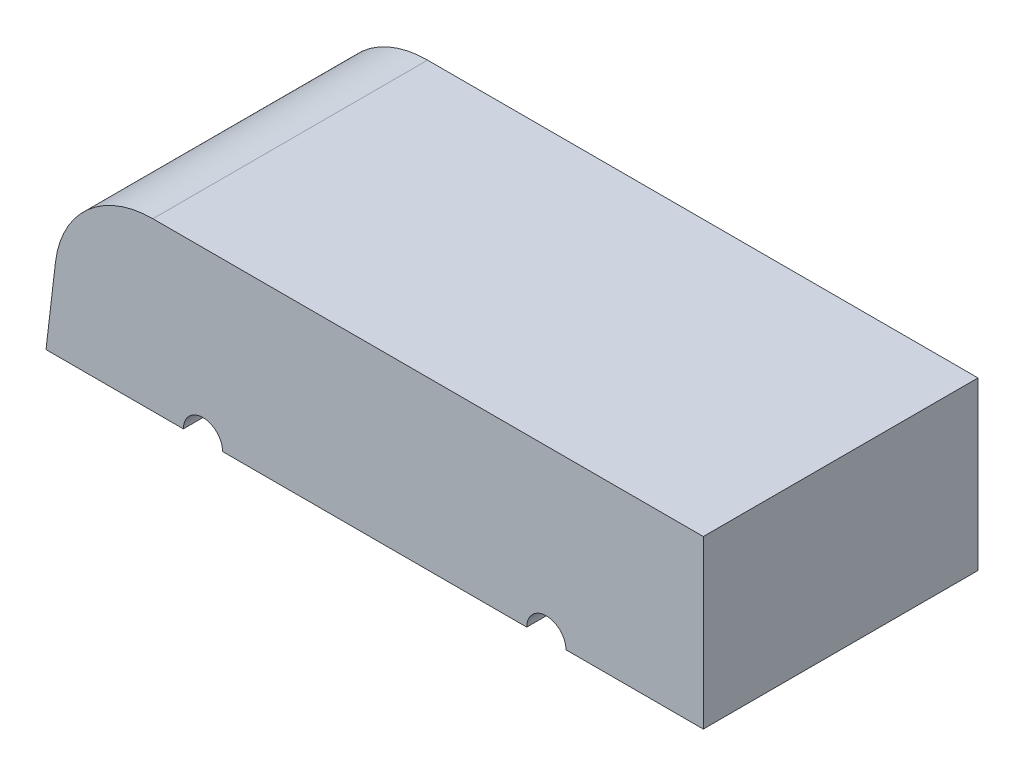
ISO-10303-21;
HEADER;
FILE_DESCRIPTION(('STEP AP214'),'2;1');
FILE_NAME('part.step','',(''),(''),'','','');
FILE_SCHEMA(('AUTOMOTIVE_DESIGN { 1 0 10303 214 1 1 1 1 }'));
ENDSEC;
DATA;
#1=APPLICATION_CONTEXT('core data for automotive mechanical design processes');
#2=APPLICATION_PROTOCOL_DEFINITION('international standard','automotive_design',2000,#1);
#3=PRODUCT_CONTEXT('',#1,'mechanical');
#4=PRODUCT('Part','Part','',(#3));
#5=PRODUCT_RELATED_PRODUCT_CATEGORY('part','',(#4));
#6=PRODUCT_DEFINITION_FORMATION('','',#4);
#7=PRODUCT_DEFINITION_CONTEXT('part definition',#1,'design');
#8=PRODUCT_DEFINITION('design','',#6,#7);
#9=PRODUCT_DEFINITION_SHAPE('','',#8);
#10=(LENGTH_UNIT() NAMED_UNIT(*) SI_UNIT(.MILLI.,.METRE.));
#11=(NAMED_UNIT(*) PLANE_ANGLE_UNIT() SI_UNIT($,.RADIAN.));
#12=(NAMED_UNIT(*) SI_UNIT($,.STERADIAN.) SOLID_ANGLE_UNIT());
#13=UNCERTAINTY_MEASURE_WITH_UNIT(LENGTH_MEASURE(1.E-05),#10,'distance_accuracy_value','');
#14=(GEOMETRIC_REPRESENTATION_CONTEXT(3) GLOBAL_UNCERTAINTY_ASSIGNED_CONTEXT((#13)) GLOBAL_UNIT_ASSIGNED_CONTEXT((#10,
#11,#12)) REPRESENTATION_CONTEXT('',''));
#15=CARTESIAN_POINT('',(0.,0.,0.));
#16=DIRECTION('',(0.,0.,1.));
#17=DIRECTION('',(1.,0.,0.));
#18=AXIS2_PLACEMENT_3D('',#15,#16,#17);
#19=CARTESIAN_POINT('',(0.,0.,35.56));
#20=DIRECTION('',(0.,1.,0.));
#21=DIRECTION('',(0.,0.,1.));
#22=AXIS2_PLACEMENT_3D('',#19,#20,#21);
#23=PLANE('',#22);
#24=DIRECTION('',(1.,0.,0.));
#25=VECTOR('',#24,1.);
#26=CARTESIAN_POINT('',(0.,0.,0.));
#27=LINE('',#26,#25);
#28=CARTESIAN_POINT('',(0.,0.,0.));
#29=VERTEX_POINT('',#28);
#30=CARTESIAN_POINT('',(17.78,0.,0.));
#31=VERTEX_POINT('',#30);
#32=EDGE_CURVE('E129',#29,#31,#27,.T.);
#33=ORIENTED_EDGE('',*,*,#32,.T.);
#34=DIRECTION('',(0.,0.,-1.));
#35=VECTOR('',#34,1.);
#36=CARTESIAN_POINT('',(17.78,0.,35.56));
#37=LINE('',#36,#35);
#38=CARTESIAN_POINT('',(17.78,0.,35.56));
#39=VERTEX_POINT('',#38);
#40=EDGE_CURVE('E110',#39,#31,#37,.T.);
#41=ORIENTED_EDGE('',*,*,#40,.F.);
#42=DIRECTION('',(1.,0.,0.));
#43=VECTOR('',#42,1.);
#44=CARTESIAN_POINT('',(0.,0.,35.56));
#45=LINE('',#44,#43);
#46=CARTESIAN_POINT('',(0.,0.,35.56));
#47=VERTEX_POINT('',#46);
#48=EDGE_CURVE('E117',#47,#39,#45,.T.);
#49=ORIENTED_EDGE('',*,*,#48,.F.);
#50=DIRECTION('',(0.,0.,-1.));
#51=VECTOR('',#50,1.);
#52=CARTESIAN_POINT('',(0.,0.,35.56));
#53=LINE('',#52,#51);
#54=EDGE_CURVE('E149',#47,#29,#53,.T.);
#55=ORIENTED_EDGE('',*,*,#54,.T.);
#56=EDGE_LOOP('',(#33,#41,#49,#55));
#57=FACE_BOUND('',#56,.T.);
#58=ADVANCED_FACE('F35',(#57),#23,.F.);
#59=CARTESIAN_POINT('',(20.32,0.,35.56));
#60=DIRECTION('',(0.,0.,-1.));
#61=DIRECTION('',(-1.,0.,0.));
#62=AXIS2_PLACEMENT_3D('',#59,#60,#61);
#63=CYLINDRICAL_SURFACE('',#62,2.54);
#64=CARTESIAN_POINT('',(20.32,0.,0.));
#65=DIRECTION('',(0.,0.,-1.));
#66=DIRECTION('',(-1.,0.,0.));
#67=AXIS2_PLACEMENT_3D('',#64,#65,#66);
#68=CIRCLE('',#67,2.54);
#69=CARTESIAN_POINT('',(22.86,0.,0.));
#70=VERTEX_POINT('',#69);
#71=EDGE_CURVE('E162',#31,#70,#68,.T.);
#72=ORIENTED_EDGE('',*,*,#71,.T.);
#73=DIRECTION('',(0.,0.,-1.));
#74=VECTOR('',#73,1.);
#75=CARTESIAN_POINT('',(22.86,0.,35.56));
#76=LINE('',#75,#74);
#77=CARTESIAN_POINT('',(22.86,0.,35.56));
#78=VERTEX_POINT('',#77);
#79=EDGE_CURVE('E113',#78,#70,#76,.T.);
#80=ORIENTED_EDGE('',*,*,#79,.F.);
#81=CARTESIAN_POINT('',(20.32,0.,35.56));
#82=DIRECTION('',(0.,0.,-1.));
#83=DIRECTION('',(-1.,0.,0.));
#84=AXIS2_PLACEMENT_3D('',#81,#82,#83);
#85=CIRCLE('',#84,2.54);
#86=EDGE_CURVE('E106',#39,#78,#85,.T.);
#87=ORIENTED_EDGE('',*,*,#86,.F.);
#88=ORIENTED_EDGE('',*,*,#40,.T.);
#89=EDGE_LOOP('',(#72,#80,#87,#88));
#90=FACE_BOUND('',#89,.T.);
#91=ADVANCED_FACE('F108',(#90),#63,.F.);
#92=CARTESIAN_POINT('',(22.86,0.,35.56));
#93=DIRECTION('',(0.,1.,0.));
#94=DIRECTION('',(0.,0.,1.));
#95=AXIS2_PLACEMENT_3D('',#92,#93,#94);
#96=PLANE('',#95);
#97=DIRECTION('',(1.,0.,0.));
#98=VECTOR('',#97,1.);
#99=CARTESIAN_POINT('',(22.86,0.,0.));
#100=LINE('',#99,#98);
#101=CARTESIAN_POINT('',(62.23,0.,0.));
#102=VERTEX_POINT('',#101);
#103=EDGE_CURVE('E160',#70,#102,#100,.T.);
#104=ORIENTED_EDGE('',*,*,#103,.T.);
#105=DIRECTION('',(0.,0.,-1.));
#106=VECTOR('',#105,1.);
#107=CARTESIAN_POINT('',(62.23,0.,35.56));
#108=LINE('',#107,#106);
#109=CARTESIAN_POINT('',(62.23,0.,35.56));
#110=VERTEX_POINT('',#109);
#111=EDGE_CURVE('E134',#110,#102,#108,.T.);
#112=ORIENTED_EDGE('',*,*,#111,.F.);
#113=DIRECTION('',(1.,0.,0.));
#114=VECTOR('',#113,1.);
#115=CARTESIAN_POINT('',(22.86,0.,35.56));
#116=LINE('',#115,#114);
#117=EDGE_CURVE('E116',#78,#110,#116,.T.);
#118=ORIENTED_EDGE('',*,*,#117,.F.);
#119=ORIENTED_EDGE('',*,*,#79,.T.);
#120=EDGE_LOOP('',(#104,#112,#118,#119));
#121=FACE_BOUND('',#120,.T.);
#122=ADVANCED_FACE('F178',(#121),#96,.F.);
#123=CARTESIAN_POINT('',(64.77,0.,35.56));
#124=DIRECTION('',(0.,0.,-1.));
#125=DIRECTION('',(-1.,0.,0.));
#126=AXIS2_PLACEMENT_3D('',#123,#124,#125);
#127=CYLINDRICAL_SURFACE('',#126,2.54);
#128=CARTESIAN_POINT('',(64.77,0.,0.));
#129=DIRECTION('',(0.,0.,-1.));
#130=DIRECTION('',(-1.,0.,0.));
#131=AXIS2_PLACEMENT_3D('',#128,#129,#130);
#132=CIRCLE('',#131,2.54);
#133=CARTESIAN_POINT('',(67.31,0.,0.));
#134=VERTEX_POINT('',#133);
#135=EDGE_CURVE('E158',#102,#134,#132,.T.);
#136=ORIENTED_EDGE('',*,*,#135,.T.);
#137=DIRECTION('',(0.,0.,-1.));
#138=VECTOR('',#137,1.);
#139=CARTESIAN_POINT('',(67.31,0.,35.56));
#140=LINE('',#139,#138);
#141=CARTESIAN_POINT('',(67.31,0.,35.56));
#142=VERTEX_POINT('',#141);
#143=EDGE_CURVE('E140',#142,#134,#140,.T.);
#144=ORIENTED_EDGE('',*,*,#143,.F.);
#145=CARTESIAN_POINT('',(64.77,0.,35.56));
#146=DIRECTION('',(0.,0.,-1.));
#147=DIRECTION('',(-1.,0.,0.));
#148=AXIS2_PLACEMENT_3D('',#145,#146,#147);
#149=CIRCLE('',#148,2.54);
#150=EDGE_CURVE('E172',#110,#142,#149,.T.);
#151=ORIENTED_EDGE('',*,*,#150,.F.);
#152=ORIENTED_EDGE('',*,*,#111,.T.);
#153=EDGE_LOOP('',(#136,#144,#151,#152));
#154=FACE_BOUND('',#153,.T.);
#155=ADVANCED_FACE('F182',(#154),#127,.F.);
#156=CARTESIAN_POINT('',(67.31,0.,35.56));
#157=DIRECTION('',(0.,1.,0.));
#158=DIRECTION('',(0.,0.,1.));
#159=AXIS2_PLACEMENT_3D('',#156,#157,#158);
#160=PLANE('',#159);
#161=DIRECTION('',(1.,0.,0.));
#162=VECTOR('',#161,1.);
#163=CARTESIAN_POINT('',(67.31,0.,0.));
#164=LINE('',#163,#162);
#165=CARTESIAN_POINT('',(85.09,0.,0.));
#166=VERTEX_POINT('',#165);
#167=EDGE_CURVE('E156',#134,#166,#164,.T.);
#168=ORIENTED_EDGE('',*,*,#167,.T.);
#169=DIRECTION('',(0.,0.,-1.));
#170=VECTOR('',#169,1.);
#171=CARTESIAN_POINT('',(85.09,0.,35.56));
#172=LINE('',#171,#170);
#173=CARTESIAN_POINT('',(85.09,0.,35.56));
#174=VERTEX_POINT('',#173);
#175=EDGE_CURVE('E143',#174,#166,#172,.T.);
#176=ORIENTED_EDGE('',*,*,#175,.F.);
#177=DIRECTION('',(1.,0.,0.));
#178=VECTOR('',#177,1.);
#179=CARTESIAN_POINT('',(67.31,0.,35.56));
#180=LINE('',#179,#178);
#181=EDGE_CURVE('E170',#142,#174,#180,.T.);
#182=ORIENTED_EDGE('',*,*,#181,.F.);
#183=ORIENTED_EDGE('',*,*,#143,.T.);
#184=EDGE_LOOP('',(#168,#176,#182,#183));
#185=FACE_BOUND('',#184,.T.);
#186=ADVANCED_FACE('F187',(#185),#160,.F.);
#187=CARTESIAN_POINT('',(85.09,0.,35.56));
#188=DIRECTION('',(-1.,0.,0.));
#189=DIRECTION('',(0.,0.,1.));
#190=AXIS2_PLACEMENT_3D('',#187,#188,#189);
#191=PLANE('',#190);
#192=DIRECTION('',(0.,1.,0.));
#193=VECTOR('',#192,1.);
#194=CARTESIAN_POINT('',(85.09,0.,0.));
#195=LINE('',#194,#193);
#196=CARTESIAN_POINT('',(85.09,21.59,0.));
#197=VERTEX_POINT('',#196);
#198=EDGE_CURVE('E154',#166,#197,#195,.T.);
#199=ORIENTED_EDGE('',*,*,#198,.T.);
#200=DIRECTION('',(0.,0.,-1.));
#201=VECTOR('',#200,1.);
#202=CARTESIAN_POINT('',(85.09,21.59,35.56));
#203=LINE('',#202,#201);
#204=CARTESIAN_POINT('',(85.09,21.59,35.56));
#205=VERTEX_POINT('',#204);
#206=EDGE_CURVE('E146',#205,#197,#203,.T.);
#207=ORIENTED_EDGE('',*,*,#206,.F.);
#208=DIRECTION('',(0.,1.,0.));
#209=VECTOR('',#208,1.);
#210=CARTESIAN_POINT('',(85.09,0.,35.56));
#211=LINE('',#210,#209);
#212=EDGE_CURVE('E168',#174,#205,#211,.T.);
#213=ORIENTED_EDGE('',*,*,#212,.F.);
#214=ORIENTED_EDGE('',*,*,#175,.T.);
#215=EDGE_LOOP('',(#199,#207,#213,#214));
#216=FACE_BOUND('',#215,.T.);
#217=ADVANCED_FACE('F192',(#216),#191,.F.);
#218=CARTESIAN_POINT('',(85.09,21.59,35.56));
#219=DIRECTION('',(0.,-1.,0.));
#220=DIRECTION('',(1.,0.,0.));
#221=AXIS2_PLACEMENT_3D('',#218,#219,#220);
#222=PLANE('',#221);
#223=DIRECTION('',(-1.,0.,0.));
#224=VECTOR('',#223,1.);
#225=CARTESIAN_POINT('',(85.09,21.59,0.));
#226=LINE('',#225,#224);
#227=CARTESIAN_POINT('',(13.8334695977365,21.59,0.));
#228=VERTEX_POINT('',#227);
#229=EDGE_CURVE('E152',#197,#228,#226,.T.);
#230=ORIENTED_EDGE('',*,*,#229,.T.);
#231=DIRECTION('',(0.,0.,-1.));
#232=VECTOR('',#231,1.);
#233=CARTESIAN_POINT('',(13.8334695977365,21.59,35.56));
#234=LINE('',#233,#232);
#235=CARTESIAN_POINT('',(13.8334695977365,21.59,35.56));
#236=VERTEX_POINT('',#235);
#237=EDGE_CURVE('E43',#228,#236,#234,.F.);
#238=ORIENTED_EDGE('',*,*,#237,.T.);
#239=DIRECTION('',(-1.,0.,0.));
#240=VECTOR('',#239,1.);
#241=CARTESIAN_POINT('',(85.09,21.59,35.56));
#242=LINE('',#241,#240);
#243=EDGE_CURVE('E166',#205,#236,#242,.T.);
#244=ORIENTED_EDGE('',*,*,#243,.F.);
#245=ORIENTED_EDGE('',*,*,#206,.T.);
#246=EDGE_LOOP('',(#230,#238,#244,#245));
#247=FACE_BOUND('',#246,.T.);
#248=ADVANCED_FACE('F194',(#247),#222,.F.);
#249=CARTESIAN_POINT('',(2.54,21.59,35.56));
#250=DIRECTION('',(0.993150604322876,-0.116841247567397,0.));
#251=DIRECTION('',(0.116841247567397,0.993150604322876,0.));
#252=AXIS2_PLACEMENT_3D('',#249,#250,#251);
#253=PLANE('',#252);
#254=DIRECTION('',(-0.116841247567397,-0.993150604322876,0.));
#255=VECTOR('',#254,1.);
#256=CARTESIAN_POINT('',(2.54,21.59,35.56));
#257=LINE('',#256,#255);
#258=CARTESIAN_POINT('',(1.22045692283599,10.3738838441059,35.56));
#259=VERTEX_POINT('',#258);
#260=EDGE_CURVE('E122',#259,#47,#257,.T.);
#261=ORIENTED_EDGE('',*,*,#260,.F.);
#262=DIRECTION('',(0.,0.,-1.));
#263=VECTOR('',#262,1.);
#264=CARTESIAN_POINT('',(1.22045692283599,10.3738838441059,35.56));
#265=LINE('',#264,#263);
#266=CARTESIAN_POINT('',(1.22045692283599,10.3738838441059,0.));
#267=VERTEX_POINT('',#266);
#268=EDGE_CURVE('E130',#259,#267,#265,.T.);
#269=ORIENTED_EDGE('',*,*,#268,.T.);
#270=DIRECTION('',(-0.116841247567397,-0.993150604322876,0.));
#271=VECTOR('',#270,1.);
#272=CARTESIAN_POINT('',(2.54,21.59,0.));
#273=LINE('',#272,#271);
#274=EDGE_CURVE('E126',#267,#29,#273,.T.);
#275=ORIENTED_EDGE('',*,*,#274,.T.);
#276=ORIENTED_EDGE('',*,*,#54,.F.);
#277=EDGE_LOOP('',(#261,#269,#275,#276));
#278=FACE_BOUND('',#277,.T.);
#279=ADVANCED_FACE('F196',(#278),#253,.F.);
#280=CARTESIAN_POINT('',(20.32,0.,35.56));
#281=DIRECTION('',(0.,0.,-1.));
#282=DIRECTION('',(-1.,0.,0.));
#283=AXIS2_PLACEMENT_3D('',#280,#281,#282);
#284=PLANE('',#283);
#285=ORIENTED_EDGE('',*,*,#243,.T.);
#286=CARTESIAN_POINT('',(13.8334695977365,8.88999999999999,35.56));
#287=DIRECTION('',(0.,0.,-1.));
#288=DIRECTION('',(-1.,0.,0.));
#289=AXIS2_PLACEMENT_3D('',#286,#287,#288);
#290=CIRCLE('',#289,12.7);
#291=EDGE_CURVE('E11',#236,#259,#290,.F.);
#292=ORIENTED_EDGE('',*,*,#291,.T.);
#293=ORIENTED_EDGE('',*,*,#260,.T.);
#294=ORIENTED_EDGE('',*,*,#48,.T.);
#295=ORIENTED_EDGE('',*,*,#86,.T.);
#296=ORIENTED_EDGE('',*,*,#117,.T.);
#297=ORIENTED_EDGE('',*,*,#150,.T.);
#298=ORIENTED_EDGE('',*,*,#181,.T.);
#299=ORIENTED_EDGE('',*,*,#212,.T.);
#300=EDGE_LOOP('',(#285,#292,#293,#294,#295,#296,#297,#298,#299));
#301=FACE_BOUND('',#300,.T.);
#302=ADVANCED_FACE('F120',(#301),#284,.F.);
#303=CARTESIAN_POINT('',(20.32,0.,0.));
#304=DIRECTION('',(0.,0.,-1.));
#305=DIRECTION('',(-1.,0.,0.));
#306=AXIS2_PLACEMENT_3D('',#303,#304,#305);
#307=PLANE('',#306);
#308=ORIENTED_EDGE('',*,*,#274,.F.);
#309=CARTESIAN_POINT('',(13.8334695977365,8.88999999999999,0.));
#310=DIRECTION('',(0.,0.,-1.));
#311=DIRECTION('',(-1.,0.,0.));
#312=AXIS2_PLACEMENT_3D('',#309,#310,#311);
#313=CIRCLE('',#312,12.7);
#314=EDGE_CURVE('E57',#267,#228,#313,.T.);
#315=ORIENTED_EDGE('',*,*,#314,.T.);
#316=ORIENTED_EDGE('',*,*,#229,.F.);
#317=ORIENTED_EDGE('',*,*,#198,.F.);
#318=ORIENTED_EDGE('',*,*,#167,.F.);
#319=ORIENTED_EDGE('',*,*,#135,.F.);
#320=ORIENTED_EDGE('',*,*,#103,.F.);
#321=ORIENTED_EDGE('',*,*,#71,.F.);
#322=ORIENTED_EDGE('',*,*,#32,.F.);
#323=EDGE_LOOP('',(#308,#315,#316,#317,#318,#319,#320,#321,#322));
#324=FACE_BOUND('',#323,.T.);
#325=ADVANCED_FACE('F243',(#324),#307,.T.);
#326=CARTESIAN_POINT('',(13.8334695977365,8.88999999999999,35.56));
#327=DIRECTION('',(0.,0.,-1.));
#328=DIRECTION('',(-1.,0.,0.));
#329=AXIS2_PLACEMENT_3D('',#326,#327,#328);
#330=CYLINDRICAL_SURFACE('',#329,12.7);
#331=ORIENTED_EDGE('',*,*,#291,.F.);
#332=ORIENTED_EDGE('',*,*,#237,.F.);
#333=ORIENTED_EDGE('',*,*,#314,.F.);
#334=ORIENTED_EDGE('',*,*,#268,.F.);
#335=EDGE_LOOP('',(#331,#332,#333,#334));
#336=FACE_BOUND('',#335,.T.);
#337=ADVANCED_FACE('F37',(#336),#330,.T.);
#338=CLOSED_SHELL('',(#58,#91,#122,#155,#186,#217,#248,#279,#302,#325,#337));
#339=MANIFOLD_SOLID_BREP('B2',#338);
#340=ADVANCED_BREP_SHAPE_REPRESENTATION('',(#18,#339),#14);
#341=SHAPE_DEFINITION_REPRESENTATION(#9,#340);
ENDSEC;
END-ISO-10303-21;
